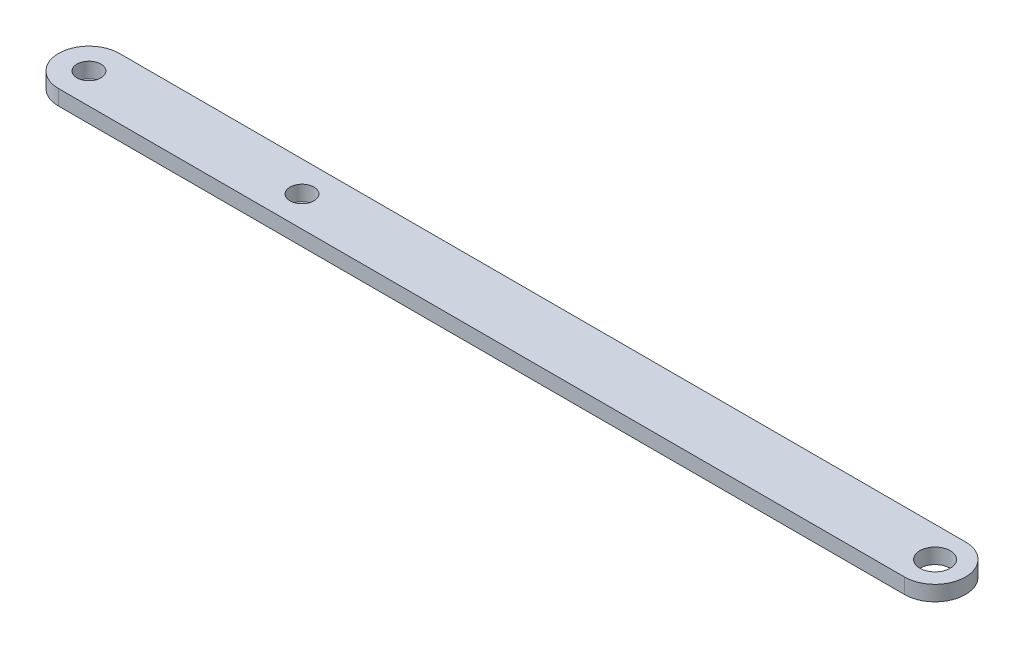
ISO-10303-21;
HEADER;
FILE_DESCRIPTION(('STEP AP214'),'2;1');
FILE_NAME('part.step','',(''),(''),'','','');
FILE_SCHEMA(('AUTOMOTIVE_DESIGN { 1 0 10303 214 1 1 1 1 }'));
ENDSEC;
DATA;
#1=APPLICATION_CONTEXT('core data for automotive mechanical design processes');
#2=APPLICATION_PROTOCOL_DEFINITION('international standard','automotive_design',2000,#1);
#3=PRODUCT_CONTEXT('',#1,'mechanical');
#4=PRODUCT('Part','Part','',(#3));
#5=PRODUCT_RELATED_PRODUCT_CATEGORY('part','',(#4));
#6=PRODUCT_DEFINITION_FORMATION('','',#4);
#7=PRODUCT_DEFINITION_CONTEXT('part definition',#1,'design');
#8=PRODUCT_DEFINITION('design','',#6,#7);
#9=PRODUCT_DEFINITION_SHAPE('','',#8);
#10=(LENGTH_UNIT() NAMED_UNIT(*) SI_UNIT(.MILLI.,.METRE.));
#11=(NAMED_UNIT(*) PLANE_ANGLE_UNIT() SI_UNIT($,.RADIAN.));
#12=(NAMED_UNIT(*) SI_UNIT($,.STERADIAN.) SOLID_ANGLE_UNIT());
#13=UNCERTAINTY_MEASURE_WITH_UNIT(LENGTH_MEASURE(1.E-05),#10,'distance_accuracy_value','');
#14=(GEOMETRIC_REPRESENTATION_CONTEXT(3) GLOBAL_UNCERTAINTY_ASSIGNED_CONTEXT((#13)) GLOBAL_UNIT_ASSIGNED_CONTEXT((#10,
#11,#12)) REPRESENTATION_CONTEXT('',''));
#15=CARTESIAN_POINT('',(0.,0.,0.));
#16=DIRECTION('',(0.,0.,1.));
#17=DIRECTION('',(1.,0.,0.));
#18=AXIS2_PLACEMENT_3D('',#15,#16,#17);
#19=CARTESIAN_POINT('',(0.,3.175,0.));
#20=DIRECTION('',(0.,1.,0.));
#21=DIRECTION('',(0.,0.,1.));
#22=AXIS2_PLACEMENT_3D('',#19,#20,#21);
#23=PLANE('',#22);
#24=CARTESIAN_POINT('',(44.45,3.175,0.));
#25=DIRECTION('',(0.,1.,0.));
#26=DIRECTION('',(0.,0.,1.));
#27=AXIS2_PLACEMENT_3D('',#24,#25,#26);
#28=CIRCLE('',#27,2.5);
#29=CARTESIAN_POINT('',(44.45,3.175,2.5));
#30=VERTEX_POINT('',#29);
#31=EDGE_CURVE('E134',#30,#30,#28,.T.);
#32=ORIENTED_EDGE('',*,*,#31,.F.);
#33=EDGE_LOOP('',(#32));
#34=FACE_BOUND('',#33,.T.);
#35=CARTESIAN_POINT('',(0.,3.175,0.));
#36=DIRECTION('',(0.,1.,0.));
#37=DIRECTION('',(0.,0.,1.));
#38=AXIS2_PLACEMENT_3D('',#35,#36,#37);
#39=CIRCLE('',#38,6.35);
#40=CARTESIAN_POINT('',(0.,3.175,-6.35));
#41=VERTEX_POINT('',#40);
#42=CARTESIAN_POINT('',(0.,3.175,6.35));
#43=VERTEX_POINT('',#42);
#44=EDGE_CURVE('E92',#41,#43,#39,.T.);
#45=ORIENTED_EDGE('',*,*,#44,.T.);
#46=DIRECTION('',(1.,0.,0.));
#47=VECTOR('',#46,1.);
#48=CARTESIAN_POINT('',(0.,3.175,6.35));
#49=LINE('',#48,#47);
#50=CARTESIAN_POINT('',(176.54778,3.175,6.35));
#51=VERTEX_POINT('',#50);
#52=EDGE_CURVE('E87',#43,#51,#49,.T.);
#53=ORIENTED_EDGE('',*,*,#52,.T.);
#54=CARTESIAN_POINT('',(176.54778,3.175,0.));
#55=DIRECTION('',(0.,1.,0.));
#56=DIRECTION('',(0.,0.,1.));
#57=AXIS2_PLACEMENT_3D('',#54,#55,#56);
#58=CIRCLE('',#57,6.35);
#59=CARTESIAN_POINT('',(176.54778,3.175,-6.35));
#60=VERTEX_POINT('',#59);
#61=EDGE_CURVE('E90',#51,#60,#58,.T.);
#62=ORIENTED_EDGE('',*,*,#61,.T.);
#63=DIRECTION('',(-1.,0.,0.));
#64=VECTOR('',#63,1.);
#65=CARTESIAN_POINT('',(0.,3.175,-6.35));
#66=LINE('',#65,#64);
#67=EDGE_CURVE('E57',#60,#41,#66,.T.);
#68=ORIENTED_EDGE('',*,*,#67,.T.);
#69=EDGE_LOOP('',(#45,#53,#62,#68));
#70=FACE_BOUND('',#69,.T.);
#71=CARTESIAN_POINT('',(0.,3.175,0.));
#72=DIRECTION('',(0.,1.,0.));
#73=DIRECTION('',(0.,0.,1.));
#74=AXIS2_PLACEMENT_3D('',#71,#72,#73);
#75=CIRCLE('',#74,2.5);
#76=CARTESIAN_POINT('',(0.,3.175,2.5));
#77=VERTEX_POINT('',#76);
#78=EDGE_CURVE('E112',#77,#77,#75,.T.);
#79=ORIENTED_EDGE('',*,*,#78,.F.);
#80=EDGE_LOOP('',(#79));
#81=FACE_BOUND('',#80,.T.);
#82=CARTESIAN_POINT('',(176.54778,3.175,0.));
#83=DIRECTION('',(0.,1.,0.));
#84=DIRECTION('',(0.,0.,1.));
#85=AXIS2_PLACEMENT_3D('',#82,#83,#84);
#86=CIRCLE('',#85,3.175);
#87=CARTESIAN_POINT('',(176.54778,3.175,3.175));
#88=VERTEX_POINT('',#87);
#89=EDGE_CURVE('E142',#88,#88,#86,.T.);
#90=ORIENTED_EDGE('',*,*,#89,.F.);
#91=EDGE_LOOP('',(#90));
#92=FACE_BOUND('',#91,.T.);
#93=ADVANCED_FACE('F39',(#34,#70,#81,#92),#23,.T.);
#94=CARTESIAN_POINT('',(0.,0.,0.));
#95=DIRECTION('',(0.,1.,0.));
#96=DIRECTION('',(0.,0.,1.));
#97=AXIS2_PLACEMENT_3D('',#94,#95,#96);
#98=PLANE('',#97);
#99=CARTESIAN_POINT('',(0.,0.,0.));
#100=DIRECTION('',(0.,1.,0.));
#101=DIRECTION('',(0.,0.,1.));
#102=AXIS2_PLACEMENT_3D('',#99,#100,#101);
#103=CIRCLE('',#102,6.35);
#104=CARTESIAN_POINT('',(0.,0.,-6.35));
#105=VERTEX_POINT('',#104);
#106=CARTESIAN_POINT('',(0.,0.,6.35));
#107=VERTEX_POINT('',#106);
#108=EDGE_CURVE('E108',#105,#107,#103,.T.);
#109=ORIENTED_EDGE('',*,*,#108,.F.);
#110=DIRECTION('',(-1.,0.,0.));
#111=VECTOR('',#110,1.);
#112=CARTESIAN_POINT('',(0.,0.,-6.35));
#113=LINE('',#112,#111);
#114=CARTESIAN_POINT('',(176.54778,0.,-6.35));
#115=VERTEX_POINT('',#114);
#116=EDGE_CURVE('E80',#115,#105,#113,.T.);
#117=ORIENTED_EDGE('',*,*,#116,.F.);
#118=CARTESIAN_POINT('',(176.54778,0.,0.));
#119=DIRECTION('',(0.,1.,0.));
#120=DIRECTION('',(0.,0.,1.));
#121=AXIS2_PLACEMENT_3D('',#118,#119,#120);
#122=CIRCLE('',#121,6.35);
#123=CARTESIAN_POINT('',(176.54778,0.,6.35));
#124=VERTEX_POINT('',#123);
#125=EDGE_CURVE('E74',#124,#115,#122,.T.);
#126=ORIENTED_EDGE('',*,*,#125,.F.);
#127=DIRECTION('',(1.,0.,0.));
#128=VECTOR('',#127,1.);
#129=CARTESIAN_POINT('',(0.,0.,6.35));
#130=LINE('',#129,#128);
#131=EDGE_CURVE('E97',#107,#124,#130,.T.);
#132=ORIENTED_EDGE('',*,*,#131,.F.);
#133=EDGE_LOOP('',(#109,#117,#126,#132));
#134=FACE_BOUND('',#133,.T.);
#135=CARTESIAN_POINT('',(0.,0.,0.));
#136=DIRECTION('',(0.,1.,0.));
#137=DIRECTION('',(0.,0.,1.));
#138=AXIS2_PLACEMENT_3D('',#135,#136,#137);
#139=CIRCLE('',#138,2.5);
#140=CARTESIAN_POINT('',(0.,0.,2.5));
#141=VERTEX_POINT('',#140);
#142=EDGE_CURVE('E130',#141,#141,#139,.T.);
#143=ORIENTED_EDGE('',*,*,#142,.T.);
#144=EDGE_LOOP('',(#143));
#145=FACE_BOUND('',#144,.T.);
#146=CARTESIAN_POINT('',(44.45,0.,0.));
#147=DIRECTION('',(0.,1.,0.));
#148=DIRECTION('',(0.,0.,1.));
#149=AXIS2_PLACEMENT_3D('',#146,#147,#148);
#150=CIRCLE('',#149,2.5);
#151=CARTESIAN_POINT('',(44.45,0.,2.5));
#152=VERTEX_POINT('',#151);
#153=EDGE_CURVE('E138',#152,#152,#150,.T.);
#154=ORIENTED_EDGE('',*,*,#153,.T.);
#155=EDGE_LOOP('',(#154));
#156=FACE_BOUND('',#155,.T.);
#157=CARTESIAN_POINT('',(176.54778,0.,0.));
#158=DIRECTION('',(0.,1.,0.));
#159=DIRECTION('',(0.,0.,1.));
#160=AXIS2_PLACEMENT_3D('',#157,#158,#159);
#161=CIRCLE('',#160,3.175);
#162=CARTESIAN_POINT('',(176.54778,0.,3.175));
#163=VERTEX_POINT('',#162);
#164=EDGE_CURVE('E146',#163,#163,#161,.T.);
#165=ORIENTED_EDGE('',*,*,#164,.T.);
#166=EDGE_LOOP('',(#165));
#167=FACE_BOUND('',#166,.T.);
#168=ADVANCED_FACE('F125',(#134,#145,#156,#167),#98,.F.);
#169=CARTESIAN_POINT('',(0.,3.175,0.));
#170=DIRECTION('',(0.,-1.,0.));
#171=DIRECTION('',(0.,0.,-1.));
#172=AXIS2_PLACEMENT_3D('',#169,#170,#171);
#173=CYLINDRICAL_SURFACE('',#172,6.35);
#174=ORIENTED_EDGE('',*,*,#108,.T.);
#175=DIRECTION('',(0.,-1.,0.));
#176=VECTOR('',#175,1.);
#177=CARTESIAN_POINT('',(0.,3.175,6.35));
#178=LINE('',#177,#176);
#179=EDGE_CURVE('E11',#43,#107,#178,.T.);
#180=ORIENTED_EDGE('',*,*,#179,.F.);
#181=ORIENTED_EDGE('',*,*,#44,.F.);
#182=DIRECTION('',(0.,-1.,0.));
#183=VECTOR('',#182,1.);
#184=CARTESIAN_POINT('',(0.,3.175,-6.35));
#185=LINE('',#184,#183);
#186=EDGE_CURVE('E104',#41,#105,#185,.T.);
#187=ORIENTED_EDGE('',*,*,#186,.T.);
#188=EDGE_LOOP('',(#174,#180,#181,#187));
#189=FACE_BOUND('',#188,.T.);
#190=ADVANCED_FACE('F41',(#189),#173,.T.);
#191=CARTESIAN_POINT('',(0.,3.175,6.35));
#192=DIRECTION('',(0.,0.,-1.));
#193=DIRECTION('',(-1.,0.,0.));
#194=AXIS2_PLACEMENT_3D('',#191,#192,#193);
#195=PLANE('',#194);
#196=ORIENTED_EDGE('',*,*,#131,.T.);
#197=DIRECTION('',(0.,-1.,0.));
#198=VECTOR('',#197,1.);
#199=CARTESIAN_POINT('',(176.54778,3.175,6.35));
#200=LINE('',#199,#198);
#201=EDGE_CURVE('E49',#51,#124,#200,.T.);
#202=ORIENTED_EDGE('',*,*,#201,.F.);
#203=ORIENTED_EDGE('',*,*,#52,.F.);
#204=ORIENTED_EDGE('',*,*,#179,.T.);
#205=EDGE_LOOP('',(#196,#202,#203,#204));
#206=FACE_BOUND('',#205,.T.);
#207=ADVANCED_FACE('F96',(#206),#195,.F.);
#208=CARTESIAN_POINT('',(176.54778,3.175,0.));
#209=DIRECTION('',(0.,-1.,0.));
#210=DIRECTION('',(0.,0.,-1.));
#211=AXIS2_PLACEMENT_3D('',#208,#209,#210);
#212=CYLINDRICAL_SURFACE('',#211,6.35);
#213=ORIENTED_EDGE('',*,*,#125,.T.);
#214=DIRECTION('',(0.,-1.,0.));
#215=VECTOR('',#214,1.);
#216=CARTESIAN_POINT('',(176.54778,3.175,-6.35));
#217=LINE('',#216,#215);
#218=EDGE_CURVE('E99',#60,#115,#217,.T.);
#219=ORIENTED_EDGE('',*,*,#218,.F.);
#220=ORIENTED_EDGE('',*,*,#61,.F.);
#221=ORIENTED_EDGE('',*,*,#201,.T.);
#222=EDGE_LOOP('',(#213,#219,#220,#221));
#223=FACE_BOUND('',#222,.T.);
#224=ADVANCED_FACE('F100',(#223),#212,.T.);
#225=CARTESIAN_POINT('',(0.,3.175,-6.35));
#226=DIRECTION('',(0.,0.,1.));
#227=DIRECTION('',(1.,0.,0.));
#228=AXIS2_PLACEMENT_3D('',#225,#226,#227);
#229=PLANE('',#228);
#230=ORIENTED_EDGE('',*,*,#116,.T.);
#231=ORIENTED_EDGE('',*,*,#186,.F.);
#232=ORIENTED_EDGE('',*,*,#67,.F.);
#233=ORIENTED_EDGE('',*,*,#218,.T.);
#234=EDGE_LOOP('',(#230,#231,#232,#233));
#235=FACE_BOUND('',#234,.T.);
#236=ADVANCED_FACE('F122',(#235),#229,.F.);
#237=CARTESIAN_POINT('',(0.,3.175,0.));
#238=DIRECTION('',(0.,-1.,0.));
#239=DIRECTION('',(0.,0.,-1.));
#240=AXIS2_PLACEMENT_3D('',#237,#238,#239);
#241=CYLINDRICAL_SURFACE('',#240,2.5);
#242=ORIENTED_EDGE('',*,*,#78,.T.);
#243=EDGE_LOOP('',(#242));
#244=FACE_BOUND('',#243,.T.);
#245=ORIENTED_EDGE('',*,*,#142,.F.);
#246=EDGE_LOOP('',(#245));
#247=FACE_BOUND('',#246,.T.);
#248=ADVANCED_FACE('F166',(#244,#247),#241,.F.);
#249=CARTESIAN_POINT('',(44.45,3.175,0.));
#250=DIRECTION('',(0.,-1.,0.));
#251=DIRECTION('',(0.,0.,-1.));
#252=AXIS2_PLACEMENT_3D('',#249,#250,#251);
#253=CYLINDRICAL_SURFACE('',#252,2.5);
#254=ORIENTED_EDGE('',*,*,#31,.T.);
#255=EDGE_LOOP('',(#254));
#256=FACE_BOUND('',#255,.T.);
#257=ORIENTED_EDGE('',*,*,#153,.F.);
#258=EDGE_LOOP('',(#257));
#259=FACE_BOUND('',#258,.T.);
#260=ADVANCED_FACE('F212',(#256,#259),#253,.F.);
#261=CARTESIAN_POINT('',(176.54778,3.175,0.));
#262=DIRECTION('',(0.,-1.,0.));
#263=DIRECTION('',(0.,0.,-1.));
#264=AXIS2_PLACEMENT_3D('',#261,#262,#263);
#265=CYLINDRICAL_SURFACE('',#264,3.175);
#266=ORIENTED_EDGE('',*,*,#89,.T.);
#267=EDGE_LOOP('',(#266));
#268=FACE_BOUND('',#267,.T.);
#269=ORIENTED_EDGE('',*,*,#164,.F.);
#270=EDGE_LOOP('',(#269));
#271=FACE_BOUND('',#270,.T.);
#272=ADVANCED_FACE('F154',(#268,#271),#265,.F.);
#273=CLOSED_SHELL('',(#93,#168,#190,#207,#224,#236,#248,#260,#272));
#274=MANIFOLD_SOLID_BREP('B2',#273);
#275=ADVANCED_BREP_SHAPE_REPRESENTATION('',(#18,#274),#14);
#276=SHAPE_DEFINITION_REPRESENTATION(#9,#275);
ENDSEC;
END-ISO-10303-21;
